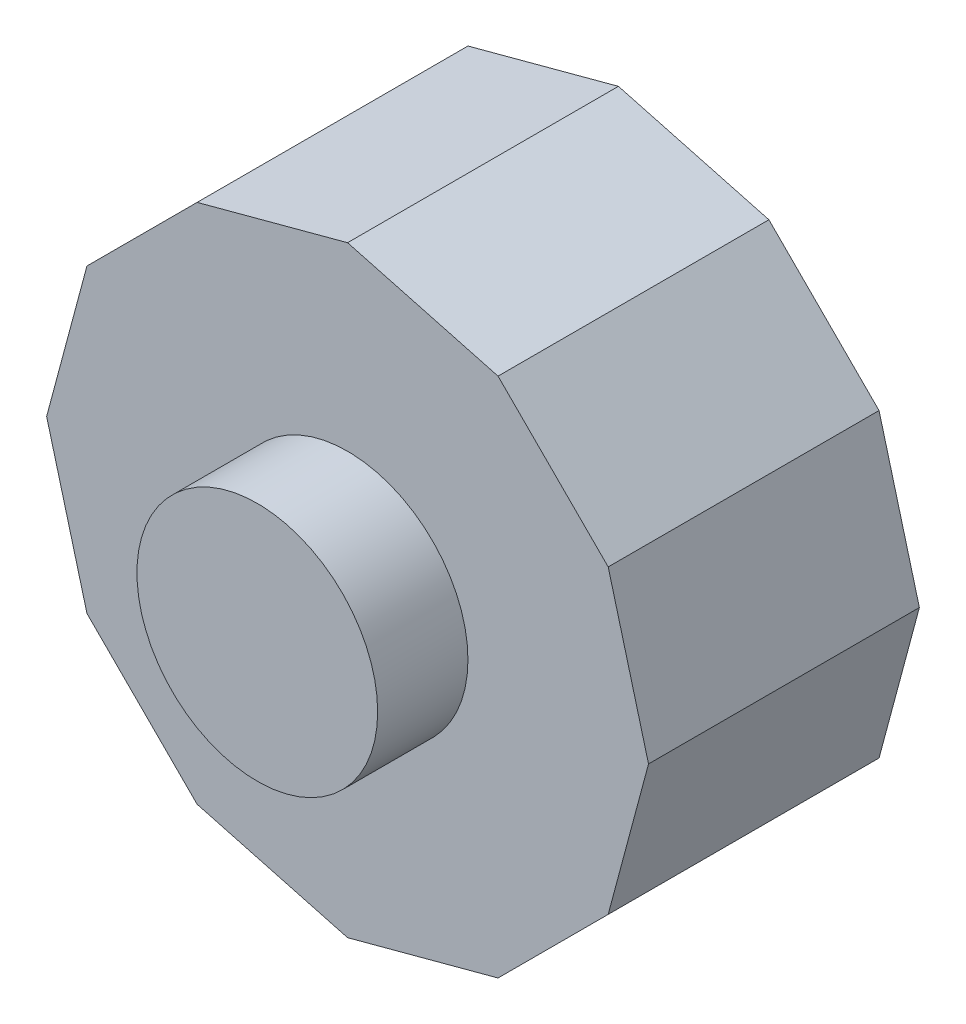
ISO-10303-21;
HEADER;
FILE_DESCRIPTION(('STEP AP214'),'2;1');
FILE_NAME('part.step','',(''),(''),'','','');
FILE_SCHEMA(('AUTOMOTIVE_DESIGN { 1 0 10303 214 1 1 1 1 }'));
ENDSEC;
DATA;
#1=APPLICATION_CONTEXT('core data for automotive mechanical design processes');
#2=APPLICATION_PROTOCOL_DEFINITION('international standard','automotive_design',2000,#1);
#3=PRODUCT_CONTEXT('',#1,'mechanical');
#4=PRODUCT('Part','Part','',(#3));
#5=PRODUCT_RELATED_PRODUCT_CATEGORY('part','',(#4));
#6=PRODUCT_DEFINITION_FORMATION('','',#4);
#7=PRODUCT_DEFINITION_CONTEXT('part definition',#1,'design');
#8=PRODUCT_DEFINITION('design','',#6,#7);
#9=PRODUCT_DEFINITION_SHAPE('','',#8);
#10=(LENGTH_UNIT() NAMED_UNIT(*) SI_UNIT(.MILLI.,.METRE.));
#11=(NAMED_UNIT(*) PLANE_ANGLE_UNIT() SI_UNIT($,.RADIAN.));
#12=(NAMED_UNIT(*) SI_UNIT($,.STERADIAN.) SOLID_ANGLE_UNIT());
#13=UNCERTAINTY_MEASURE_WITH_UNIT(LENGTH_MEASURE(1.E-05),#10,'distance_accuracy_value','');
#14=(GEOMETRIC_REPRESENTATION_CONTEXT(3) GLOBAL_UNCERTAINTY_ASSIGNED_CONTEXT((#13)) GLOBAL_UNIT_ASSIGNED_CONTEXT((#10,
#11,#12)) REPRESENTATION_CONTEXT('',''));
#15=CARTESIAN_POINT('',(0.,0.,0.));
#16=DIRECTION('',(0.,0.,1.));
#17=DIRECTION('',(1.,0.,0.));
#18=AXIS2_PLACEMENT_3D('',#15,#16,#17);
#19=CARTESIAN_POINT('',(0.,0.,18.));
#20=DIRECTION('',(0.,0.,1.));
#21=DIRECTION('',(1.,0.,0.));
#22=AXIS2_PLACEMENT_3D('',#19,#20,#21);
#23=PLANE('',#22);
#24=CARTESIAN_POINT('',(0.,0.,18.));
#25=DIRECTION('',(0.,0.,1.));
#26=DIRECTION('',(1.,0.,0.));
#27=AXIS2_PLACEMENT_3D('',#24,#25,#26);
#28=CIRCLE('',#27,8.);
#29=CARTESIAN_POINT('',(8.,0.,18.));
#30=VERTEX_POINT('',#29);
#31=EDGE_CURVE('E46',#30,#30,#28,.T.);
#32=ORIENTED_EDGE('',*,*,#31,.F.);
#33=EDGE_LOOP('',(#32));
#34=FACE_BOUND('',#33,.T.);
#35=DIRECTION('',(0.707106781186547,0.707106781186548,0.));
#36=VECTOR('',#35,1.);
#37=CARTESIAN_POINT('',(10.,-17.3205080756888,18.));
#38=LINE('',#37,#36);
#39=CARTESIAN_POINT('',(10.,-17.3205080756888,18.));
#40=VERTEX_POINT('',#39);
#41=CARTESIAN_POINT('',(17.3205080756888,-9.99999999999999,18.));
#42=VERTEX_POINT('',#41);
#43=EDGE_CURVE('E209',#40,#42,#38,.T.);
#44=ORIENTED_EDGE('',*,*,#43,.T.);
#45=DIRECTION('',(0.258819045102521,0.965925826289068,0.));
#46=VECTOR('',#45,1.);
#47=CARTESIAN_POINT('',(17.3205080756888,-9.99999999999999,18.));
#48=LINE('',#47,#46);
#49=CARTESIAN_POINT('',(20.,0.,18.));
#50=VERTEX_POINT('',#49);
#51=EDGE_CURVE('E180',#42,#50,#48,.T.);
#52=ORIENTED_EDGE('',*,*,#51,.T.);
#53=DIRECTION('',(-0.258819045102521,0.965925826289068,0.));
#54=VECTOR('',#53,1.);
#55=CARTESIAN_POINT('',(20.,0.,18.));
#56=LINE('',#55,#54);
#57=CARTESIAN_POINT('',(17.3205080756888,10.,18.));
#58=VERTEX_POINT('',#57);
#59=EDGE_CURVE('E183',#50,#58,#56,.T.);
#60=ORIENTED_EDGE('',*,*,#59,.T.);
#61=DIRECTION('',(-0.707106781186547,0.707106781186548,0.));
#62=VECTOR('',#61,1.);
#63=CARTESIAN_POINT('',(17.3205080756888,10.,18.));
#64=LINE('',#63,#62);
#65=CARTESIAN_POINT('',(10.,17.3205080756888,18.));
#66=VERTEX_POINT('',#65);
#67=EDGE_CURVE('E57',#58,#66,#64,.T.);
#68=ORIENTED_EDGE('',*,*,#67,.T.);
#69=DIRECTION('',(-0.965925826289068,0.258819045102521,0.));
#70=VECTOR('',#69,1.);
#71=CARTESIAN_POINT('',(10.,17.3205080756888,18.));
#72=LINE('',#71,#70);
#73=CARTESIAN_POINT('',(0.,20.,18.));
#74=VERTEX_POINT('',#73);
#75=EDGE_CURVE('E138',#66,#74,#72,.T.);
#76=ORIENTED_EDGE('',*,*,#75,.T.);
#77=DIRECTION('',(-0.965925826289068,-0.258819045102521,0.));
#78=VECTOR('',#77,1.);
#79=CARTESIAN_POINT('',(0.,20.,18.));
#80=LINE('',#79,#78);
#81=CARTESIAN_POINT('',(-9.99999999999999,17.3205080756888,18.));
#82=VERTEX_POINT('',#81);
#83=EDGE_CURVE('E188',#74,#82,#80,.T.);
#84=ORIENTED_EDGE('',*,*,#83,.T.);
#85=DIRECTION('',(-0.707106781186548,-0.707106781186547,0.));
#86=VECTOR('',#85,1.);
#87=CARTESIAN_POINT('',(-9.99999999999999,17.3205080756888,18.));
#88=LINE('',#87,#86);
#89=CARTESIAN_POINT('',(-17.3205080756888,10.,18.));
#90=VERTEX_POINT('',#89);
#91=EDGE_CURVE('E191',#82,#90,#88,.T.);
#92=ORIENTED_EDGE('',*,*,#91,.T.);
#93=DIRECTION('',(-0.258819045102521,-0.965925826289068,0.));
#94=VECTOR('',#93,1.);
#95=CARTESIAN_POINT('',(-17.3205080756888,10.,18.));
#96=LINE('',#95,#94);
#97=CARTESIAN_POINT('',(-20.,0.,18.));
#98=VERTEX_POINT('',#97);
#99=EDGE_CURVE('E194',#90,#98,#96,.T.);
#100=ORIENTED_EDGE('',*,*,#99,.T.);
#101=DIRECTION('',(0.258819045102521,-0.965925826289068,0.));
#102=VECTOR('',#101,1.);
#103=CARTESIAN_POINT('',(-20.,0.,18.));
#104=LINE('',#103,#102);
#105=CARTESIAN_POINT('',(-17.3205080756888,-9.99999999999999,18.));
#106=VERTEX_POINT('',#105);
#107=EDGE_CURVE('E197',#98,#106,#104,.T.);
#108=ORIENTED_EDGE('',*,*,#107,.T.);
#109=DIRECTION('',(0.707106781186548,-0.707106781186547,0.));
#110=VECTOR('',#109,1.);
#111=CARTESIAN_POINT('',(-17.3205080756888,-9.99999999999999,18.));
#112=LINE('',#111,#110);
#113=CARTESIAN_POINT('',(-9.99999999999999,-17.3205080756888,18.));
#114=VERTEX_POINT('',#113);
#115=EDGE_CURVE('E200',#106,#114,#112,.T.);
#116=ORIENTED_EDGE('',*,*,#115,.T.);
#117=DIRECTION('',(0.965925826289068,-0.258819045102521,0.));
#118=VECTOR('',#117,1.);
#119=CARTESIAN_POINT('',(-9.99999999999999,-17.3205080756888,18.));
#120=LINE('',#119,#118);
#121=CARTESIAN_POINT('',(0.,-20.,18.));
#122=VERTEX_POINT('',#121);
#123=EDGE_CURVE('E203',#114,#122,#120,.T.);
#124=ORIENTED_EDGE('',*,*,#123,.T.);
#125=DIRECTION('',(0.965925826289068,0.258819045102521,0.));
#126=VECTOR('',#125,1.);
#127=CARTESIAN_POINT('',(0.,-20.,18.));
#128=LINE('',#127,#126);
#129=EDGE_CURVE('E206',#122,#40,#128,.T.);
#130=ORIENTED_EDGE('',*,*,#129,.T.);
#131=EDGE_LOOP('',(#44,#52,#60,#68,#76,#84,#92,#100,#108,#116,#124,#130));
#132=FACE_BOUND('',#131,.T.);
#133=ADVANCED_FACE('F42',(#34,#132),#23,.T.);
#134=CARTESIAN_POINT('',(0.,0.,24.));
#135=DIRECTION('',(0.,0.,-1.));
#136=DIRECTION('',(-1.,0.,0.));
#137=AXIS2_PLACEMENT_3D('',#134,#135,#136);
#138=CYLINDRICAL_SURFACE('',#137,8.);
#139=ORIENTED_EDGE('',*,*,#31,.T.);
#140=EDGE_LOOP('',(#139));
#141=FACE_BOUND('',#140,.T.);
#142=CARTESIAN_POINT('',(0.,0.,24.));
#143=DIRECTION('',(0.,0.,1.));
#144=DIRECTION('',(1.,0.,0.));
#145=AXIS2_PLACEMENT_3D('',#142,#143,#144);
#146=CIRCLE('',#145,8.);
#147=CARTESIAN_POINT('',(8.,0.,24.));
#148=VERTEX_POINT('',#147);
#149=EDGE_CURVE('E12',#148,#148,#146,.T.);
#150=ORIENTED_EDGE('',*,*,#149,.F.);
#151=EDGE_LOOP('',(#150));
#152=FACE_BOUND('',#151,.T.);
#153=ADVANCED_FACE('F44',(#141,#152),#138,.T.);
#154=CARTESIAN_POINT('',(0.,0.,24.));
#155=DIRECTION('',(0.,0.,1.));
#156=DIRECTION('',(1.,0.,0.));
#157=AXIS2_PLACEMENT_3D('',#154,#155,#156);
#158=PLANE('',#157);
#159=ORIENTED_EDGE('',*,*,#149,.T.);
#160=EDGE_LOOP('',(#159));
#161=FACE_BOUND('',#160,.T.);
#162=ADVANCED_FACE('F282',(#161),#158,.T.);
#163=CARTESIAN_POINT('',(17.3205080756888,-9.99999999999999,0.));
#164=DIRECTION('',(0.965925826289068,-0.258819045102521,0.));
#165=DIRECTION('',(0.258819045102521,0.965925826289068,0.));
#166=AXIS2_PLACEMENT_3D('',#163,#164,#165);
#167=PLANE('',#166);
#168=ORIENTED_EDGE('',*,*,#51,.F.);
#169=DIRECTION('',(0.,0.,1.));
#170=VECTOR('',#169,1.);
#171=CARTESIAN_POINT('',(17.3205080756888,-9.99999999999999,0.));
#172=LINE('',#171,#170);
#173=CARTESIAN_POINT('',(17.3205080756888,-9.99999999999999,0.));
#174=VERTEX_POINT('',#173);
#175=EDGE_CURVE('E212',#174,#42,#172,.T.);
#176=ORIENTED_EDGE('',*,*,#175,.F.);
#177=DIRECTION('',(0.258819045102521,0.965925826289068,0.));
#178=VECTOR('',#177,1.);
#179=CARTESIAN_POINT('',(17.3205080756888,-9.99999999999999,0.));
#180=LINE('',#179,#178);
#181=CARTESIAN_POINT('',(20.,0.,0.));
#182=VERTEX_POINT('',#181);
#183=EDGE_CURVE('E65',#174,#182,#180,.T.);
#184=ORIENTED_EDGE('',*,*,#183,.T.);
#185=DIRECTION('',(0.,0.,1.));
#186=VECTOR('',#185,1.);
#187=CARTESIAN_POINT('',(20.,0.,0.));
#188=LINE('',#187,#186);
#189=EDGE_CURVE('E179',#182,#50,#188,.T.);
#190=ORIENTED_EDGE('',*,*,#189,.T.);
#191=EDGE_LOOP('',(#168,#176,#184,#190));
#192=FACE_BOUND('',#191,.T.);
#193=ADVANCED_FACE('F232',(#192),#167,.T.);
#194=CARTESIAN_POINT('',(10.,-17.3205080756888,0.));
#195=DIRECTION('',(0.707106781186548,-0.707106781186547,0.));
#196=DIRECTION('',(0.707106781186547,0.707106781186548,0.));
#197=AXIS2_PLACEMENT_3D('',#194,#195,#196);
#198=PLANE('',#197);
#199=ORIENTED_EDGE('',*,*,#43,.F.);
#200=DIRECTION('',(0.,0.,1.));
#201=VECTOR('',#200,1.);
#202=CARTESIAN_POINT('',(10.,-17.3205080756888,0.));
#203=LINE('',#202,#201);
#204=CARTESIAN_POINT('',(10.,-17.3205080756888,0.));
#205=VERTEX_POINT('',#204);
#206=EDGE_CURVE('E214',#205,#40,#203,.T.);
#207=ORIENTED_EDGE('',*,*,#206,.F.);
#208=DIRECTION('',(0.707106781186547,0.707106781186548,0.));
#209=VECTOR('',#208,1.);
#210=CARTESIAN_POINT('',(10.,-17.3205080756888,0.));
#211=LINE('',#210,#209);
#212=EDGE_CURVE('E176',#205,#174,#211,.T.);
#213=ORIENTED_EDGE('',*,*,#212,.T.);
#214=ORIENTED_EDGE('',*,*,#175,.T.);
#215=EDGE_LOOP('',(#199,#207,#213,#214));
#216=FACE_BOUND('',#215,.T.);
#217=ADVANCED_FACE('F239',(#216),#198,.T.);
#218=CARTESIAN_POINT('',(0.,-20.,0.));
#219=DIRECTION('',(0.258819045102521,-0.965925826289068,0.));
#220=DIRECTION('',(0.965925826289068,0.258819045102521,0.));
#221=AXIS2_PLACEMENT_3D('',#218,#219,#220);
#222=PLANE('',#221);
#223=ORIENTED_EDGE('',*,*,#129,.F.);
#224=DIRECTION('',(0.,0.,1.));
#225=VECTOR('',#224,1.);
#226=CARTESIAN_POINT('',(0.,-20.,0.));
#227=LINE('',#226,#225);
#228=CARTESIAN_POINT('',(0.,-20.,0.));
#229=VERTEX_POINT('',#228);
#230=EDGE_CURVE('E216',#229,#122,#227,.T.);
#231=ORIENTED_EDGE('',*,*,#230,.F.);
#232=DIRECTION('',(0.965925826289068,0.258819045102521,0.));
#233=VECTOR('',#232,1.);
#234=CARTESIAN_POINT('',(0.,-20.,0.));
#235=LINE('',#234,#233);
#236=EDGE_CURVE('E173',#229,#205,#235,.T.);
#237=ORIENTED_EDGE('',*,*,#236,.T.);
#238=ORIENTED_EDGE('',*,*,#206,.T.);
#239=EDGE_LOOP('',(#223,#231,#237,#238));
#240=FACE_BOUND('',#239,.T.);
#241=ADVANCED_FACE('F246',(#240),#222,.T.);
#242=CARTESIAN_POINT('',(-9.99999999999999,-17.3205080756888,0.));
#243=DIRECTION('',(-0.258819045102521,-0.965925826289068,0.));
#244=DIRECTION('',(0.965925826289068,-0.258819045102521,0.));
#245=AXIS2_PLACEMENT_3D('',#242,#243,#244);
#246=PLANE('',#245);
#247=ORIENTED_EDGE('',*,*,#123,.F.);
#248=DIRECTION('',(0.,0.,1.));
#249=VECTOR('',#248,1.);
#250=CARTESIAN_POINT('',(-9.99999999999999,-17.3205080756888,0.));
#251=LINE('',#250,#249);
#252=CARTESIAN_POINT('',(-9.99999999999999,-17.3205080756888,0.));
#253=VERTEX_POINT('',#252);
#254=EDGE_CURVE('E218',#253,#114,#251,.T.);
#255=ORIENTED_EDGE('',*,*,#254,.F.);
#256=DIRECTION('',(0.965925826289068,-0.258819045102521,0.));
#257=VECTOR('',#256,1.);
#258=CARTESIAN_POINT('',(-9.99999999999999,-17.3205080756888,0.));
#259=LINE('',#258,#257);
#260=EDGE_CURVE('E170',#253,#229,#259,.T.);
#261=ORIENTED_EDGE('',*,*,#260,.T.);
#262=ORIENTED_EDGE('',*,*,#230,.T.);
#263=EDGE_LOOP('',(#247,#255,#261,#262));
#264=FACE_BOUND('',#263,.T.);
#265=ADVANCED_FACE('F249',(#264),#246,.T.);
#266=CARTESIAN_POINT('',(-17.3205080756888,-9.99999999999999,0.));
#267=DIRECTION('',(-0.707106781186547,-0.707106781186548,0.));
#268=DIRECTION('',(0.707106781186548,-0.707106781186547,0.));
#269=AXIS2_PLACEMENT_3D('',#266,#267,#268);
#270=PLANE('',#269);
#271=ORIENTED_EDGE('',*,*,#115,.F.);
#272=DIRECTION('',(0.,0.,1.));
#273=VECTOR('',#272,1.);
#274=CARTESIAN_POINT('',(-17.3205080756888,-9.99999999999999,0.));
#275=LINE('',#274,#273);
#276=CARTESIAN_POINT('',(-17.3205080756888,-9.99999999999999,0.));
#277=VERTEX_POINT('',#276);
#278=EDGE_CURVE('E220',#277,#106,#275,.T.);
#279=ORIENTED_EDGE('',*,*,#278,.F.);
#280=DIRECTION('',(0.707106781186548,-0.707106781186547,0.));
#281=VECTOR('',#280,1.);
#282=CARTESIAN_POINT('',(-17.3205080756888,-9.99999999999999,0.));
#283=LINE('',#282,#281);
#284=EDGE_CURVE('E167',#277,#253,#283,.T.);
#285=ORIENTED_EDGE('',*,*,#284,.T.);
#286=ORIENTED_EDGE('',*,*,#254,.T.);
#287=EDGE_LOOP('',(#271,#279,#285,#286));
#288=FACE_BOUND('',#287,.T.);
#289=ADVANCED_FACE('F252',(#288),#270,.T.);
#290=CARTESIAN_POINT('',(-20.,0.,0.));
#291=DIRECTION('',(-0.965925826289068,-0.258819045102521,0.));
#292=DIRECTION('',(0.258819045102521,-0.965925826289068,0.));
#293=AXIS2_PLACEMENT_3D('',#290,#291,#292);
#294=PLANE('',#293);
#295=ORIENTED_EDGE('',*,*,#107,.F.);
#296=DIRECTION('',(0.,0.,1.));
#297=VECTOR('',#296,1.);
#298=CARTESIAN_POINT('',(-20.,0.,0.));
#299=LINE('',#298,#297);
#300=CARTESIAN_POINT('',(-20.,0.,0.));
#301=VERTEX_POINT('',#300);
#302=EDGE_CURVE('E222',#301,#98,#299,.T.);
#303=ORIENTED_EDGE('',*,*,#302,.F.);
#304=DIRECTION('',(0.258819045102521,-0.965925826289068,0.));
#305=VECTOR('',#304,1.);
#306=CARTESIAN_POINT('',(-20.,0.,0.));
#307=LINE('',#306,#305);
#308=EDGE_CURVE('E164',#301,#277,#307,.T.);
#309=ORIENTED_EDGE('',*,*,#308,.T.);
#310=ORIENTED_EDGE('',*,*,#278,.T.);
#311=EDGE_LOOP('',(#295,#303,#309,#310));
#312=FACE_BOUND('',#311,.T.);
#313=ADVANCED_FACE('F257',(#312),#294,.T.);
#314=CARTESIAN_POINT('',(-17.3205080756888,10.,0.));
#315=DIRECTION('',(-0.965925826289068,0.258819045102521,0.));
#316=DIRECTION('',(-0.258819045102521,-0.965925826289068,0.));
#317=AXIS2_PLACEMENT_3D('',#314,#315,#316);
#318=PLANE('',#317);
#319=ORIENTED_EDGE('',*,*,#99,.F.);
#320=DIRECTION('',(0.,0.,1.));
#321=VECTOR('',#320,1.);
#322=CARTESIAN_POINT('',(-17.3205080756888,10.,0.));
#323=LINE('',#322,#321);
#324=CARTESIAN_POINT('',(-17.3205080756888,10.,0.));
#325=VERTEX_POINT('',#324);
#326=EDGE_CURVE('E224',#325,#90,#323,.T.);
#327=ORIENTED_EDGE('',*,*,#326,.F.);
#328=DIRECTION('',(-0.258819045102521,-0.965925826289068,0.));
#329=VECTOR('',#328,1.);
#330=CARTESIAN_POINT('',(-17.3205080756888,10.,0.));
#331=LINE('',#330,#329);
#332=EDGE_CURVE('E161',#325,#301,#331,.T.);
#333=ORIENTED_EDGE('',*,*,#332,.T.);
#334=ORIENTED_EDGE('',*,*,#302,.T.);
#335=EDGE_LOOP('',(#319,#327,#333,#334));
#336=FACE_BOUND('',#335,.T.);
#337=ADVANCED_FACE('F260',(#336),#318,.T.);
#338=CARTESIAN_POINT('',(-9.99999999999999,17.3205080756888,0.));
#339=DIRECTION('',(-0.707106781186547,0.707106781186548,0.));
#340=DIRECTION('',(-0.707106781186548,-0.707106781186547,0.));
#341=AXIS2_PLACEMENT_3D('',#338,#339,#340);
#342=PLANE('',#341);
#343=ORIENTED_EDGE('',*,*,#91,.F.);
#344=DIRECTION('',(0.,0.,1.));
#345=VECTOR('',#344,1.);
#346=CARTESIAN_POINT('',(-9.99999999999999,17.3205080756888,0.));
#347=LINE('',#346,#345);
#348=CARTESIAN_POINT('',(-9.99999999999999,17.3205080756888,0.));
#349=VERTEX_POINT('',#348);
#350=EDGE_CURVE('E226',#349,#82,#347,.T.);
#351=ORIENTED_EDGE('',*,*,#350,.F.);
#352=DIRECTION('',(-0.707106781186548,-0.707106781186547,0.));
#353=VECTOR('',#352,1.);
#354=CARTESIAN_POINT('',(-9.99999999999999,17.3205080756888,0.));
#355=LINE('',#354,#353);
#356=EDGE_CURVE('E155',#349,#325,#355,.T.);
#357=ORIENTED_EDGE('',*,*,#356,.T.);
#358=ORIENTED_EDGE('',*,*,#326,.T.);
#359=EDGE_LOOP('',(#343,#351,#357,#358));
#360=FACE_BOUND('',#359,.T.);
#361=ADVANCED_FACE('F263',(#360),#342,.T.);
#362=CARTESIAN_POINT('',(0.,20.,0.));
#363=DIRECTION('',(-0.258819045102521,0.965925826289068,0.));
#364=DIRECTION('',(-0.965925826289068,-0.258819045102521,0.));
#365=AXIS2_PLACEMENT_3D('',#362,#363,#364);
#366=PLANE('',#365);
#367=ORIENTED_EDGE('',*,*,#83,.F.);
#368=DIRECTION('',(0.,0.,1.));
#369=VECTOR('',#368,1.);
#370=CARTESIAN_POINT('',(0.,20.,0.));
#371=LINE('',#370,#369);
#372=CARTESIAN_POINT('',(0.,20.,0.));
#373=VERTEX_POINT('',#372);
#374=EDGE_CURVE('E139',#373,#74,#371,.T.);
#375=ORIENTED_EDGE('',*,*,#374,.F.);
#376=DIRECTION('',(-0.965925826289068,-0.258819045102521,0.));
#377=VECTOR('',#376,1.);
#378=CARTESIAN_POINT('',(0.,20.,0.));
#379=LINE('',#378,#377);
#380=EDGE_CURVE('E153',#373,#349,#379,.T.);
#381=ORIENTED_EDGE('',*,*,#380,.T.);
#382=ORIENTED_EDGE('',*,*,#350,.T.);
#383=EDGE_LOOP('',(#367,#375,#381,#382));
#384=FACE_BOUND('',#383,.T.);
#385=ADVANCED_FACE('F266',(#384),#366,.T.);
#386=CARTESIAN_POINT('',(10.,17.3205080756888,0.));
#387=DIRECTION('',(0.258819045102521,0.965925826289068,0.));
#388=DIRECTION('',(-0.965925826289068,0.258819045102521,0.));
#389=AXIS2_PLACEMENT_3D('',#386,#387,#388);
#390=PLANE('',#389);
#391=ORIENTED_EDGE('',*,*,#75,.F.);
#392=DIRECTION('',(0.,0.,1.));
#393=VECTOR('',#392,1.);
#394=CARTESIAN_POINT('',(10.,17.3205080756888,0.));
#395=LINE('',#394,#393);
#396=CARTESIAN_POINT('',(10.,17.3205080756888,0.));
#397=VERTEX_POINT('',#396);
#398=EDGE_CURVE('E131',#397,#66,#395,.T.);
#399=ORIENTED_EDGE('',*,*,#398,.F.);
#400=DIRECTION('',(-0.965925826289068,0.258819045102521,0.));
#401=VECTOR('',#400,1.);
#402=CARTESIAN_POINT('',(10.,17.3205080756888,0.));
#403=LINE('',#402,#401);
#404=EDGE_CURVE('E135',#397,#373,#403,.T.);
#405=ORIENTED_EDGE('',*,*,#404,.T.);
#406=ORIENTED_EDGE('',*,*,#374,.T.);
#407=EDGE_LOOP('',(#391,#399,#405,#406));
#408=FACE_BOUND('',#407,.T.);
#409=ADVANCED_FACE('F133',(#408),#390,.T.);
#410=CARTESIAN_POINT('',(17.3205080756888,10.,0.));
#411=DIRECTION('',(0.707106781186548,0.707106781186547,0.));
#412=DIRECTION('',(-0.707106781186547,0.707106781186548,0.));
#413=AXIS2_PLACEMENT_3D('',#410,#411,#412);
#414=PLANE('',#413);
#415=ORIENTED_EDGE('',*,*,#67,.F.);
#416=DIRECTION('',(0.,0.,1.));
#417=VECTOR('',#416,1.);
#418=CARTESIAN_POINT('',(17.3205080756888,10.,0.));
#419=LINE('',#418,#417);
#420=CARTESIAN_POINT('',(17.3205080756888,10.,0.));
#421=VERTEX_POINT('',#420);
#422=EDGE_CURVE('E140',#421,#58,#419,.T.);
#423=ORIENTED_EDGE('',*,*,#422,.F.);
#424=DIRECTION('',(-0.707106781186547,0.707106781186548,0.));
#425=VECTOR('',#424,1.);
#426=CARTESIAN_POINT('',(17.3205080756888,10.,0.));
#427=LINE('',#426,#425);
#428=EDGE_CURVE('E143',#421,#397,#427,.T.);
#429=ORIENTED_EDGE('',*,*,#428,.T.);
#430=ORIENTED_EDGE('',*,*,#398,.T.);
#431=EDGE_LOOP('',(#415,#423,#429,#430));
#432=FACE_BOUND('',#431,.T.);
#433=ADVANCED_FACE('F144',(#432),#414,.T.);
#434=CARTESIAN_POINT('',(20.,0.,0.));
#435=DIRECTION('',(0.965925826289068,0.258819045102521,0.));
#436=DIRECTION('',(-0.258819045102521,0.965925826289068,0.));
#437=AXIS2_PLACEMENT_3D('',#434,#435,#436);
#438=PLANE('',#437);
#439=ORIENTED_EDGE('',*,*,#59,.F.);
#440=ORIENTED_EDGE('',*,*,#189,.F.);
#441=DIRECTION('',(-0.258819045102521,0.965925826289068,0.));
#442=VECTOR('',#441,1.);
#443=CARTESIAN_POINT('',(20.,0.,0.));
#444=LINE('',#443,#442);
#445=EDGE_CURVE('E148',#182,#421,#444,.T.);
#446=ORIENTED_EDGE('',*,*,#445,.T.);
#447=ORIENTED_EDGE('',*,*,#422,.T.);
#448=EDGE_LOOP('',(#439,#440,#446,#447));
#449=FACE_BOUND('',#448,.T.);
#450=ADVANCED_FACE('F234',(#449),#438,.T.);
#451=CARTESIAN_POINT('',(0.,0.,0.));
#452=DIRECTION('',(0.,0.,1.));
#453=DIRECTION('',(1.,0.,0.));
#454=AXIS2_PLACEMENT_3D('',#451,#452,#453);
#455=PLANE('',#454);
#456=ORIENTED_EDGE('',*,*,#183,.F.);
#457=ORIENTED_EDGE('',*,*,#212,.F.);
#458=ORIENTED_EDGE('',*,*,#236,.F.);
#459=ORIENTED_EDGE('',*,*,#260,.F.);
#460=ORIENTED_EDGE('',*,*,#284,.F.);
#461=ORIENTED_EDGE('',*,*,#308,.F.);
#462=ORIENTED_EDGE('',*,*,#332,.F.);
#463=ORIENTED_EDGE('',*,*,#356,.F.);
#464=ORIENTED_EDGE('',*,*,#380,.F.);
#465=ORIENTED_EDGE('',*,*,#404,.F.);
#466=ORIENTED_EDGE('',*,*,#428,.F.);
#467=ORIENTED_EDGE('',*,*,#445,.F.);
#468=EDGE_LOOP('',(#456,#457,#458,#459,#460,#461,#462,#463,#464,#465,#466,#467));
#469=FACE_BOUND('',#468,.T.);
#470=ADVANCED_FACE('F150',(#469),#455,.F.);
#471=CLOSED_SHELL('',(#133,#153,#162,#193,#217,#241,#265,#289,#313,#337,#361,#385,#409,#433,
#450,#470));
#472=MANIFOLD_SOLID_BREP('B2',#471);
#473=ADVANCED_BREP_SHAPE_REPRESENTATION('',(#18,#472),#14);
#474=SHAPE_DEFINITION_REPRESENTATION(#9,#473);
ENDSEC;
END-ISO-10303-21;
